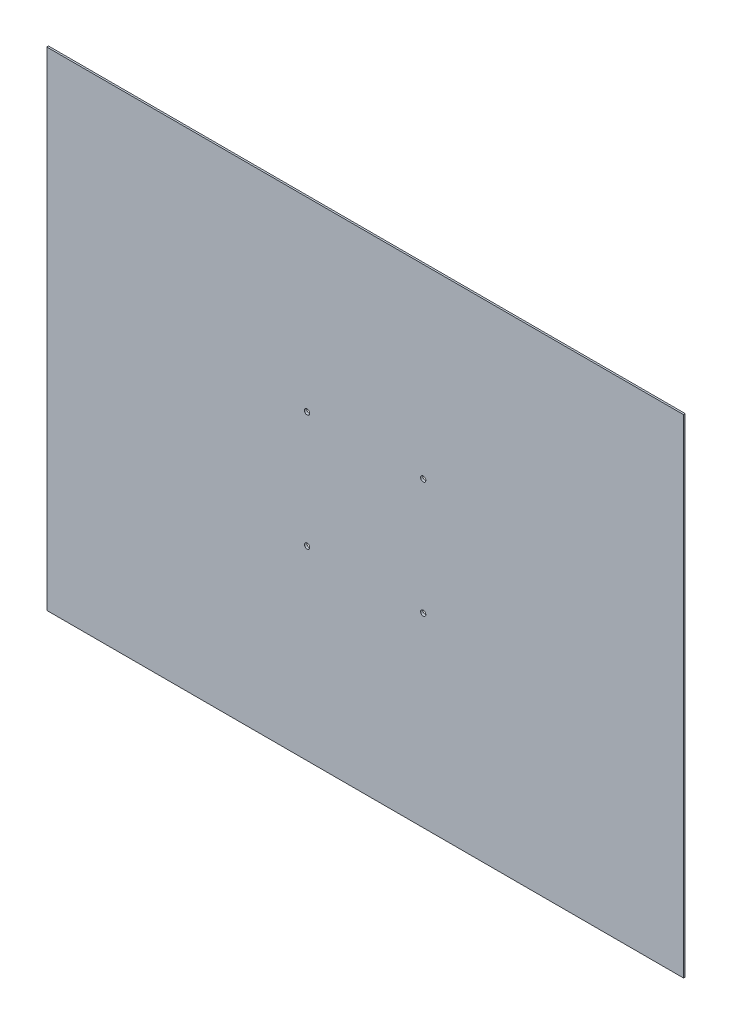
ISO-10303-21;
HEADER;
FILE_DESCRIPTION(('STEP AP214'),'2;1');
FILE_NAME('part.step','',(''),(''),'','','');
FILE_SCHEMA(('AUTOMOTIVE_DESIGN { 1 0 10303 214 1 1 1 1 }'));
ENDSEC;
DATA;
#1=APPLICATION_CONTEXT('core data for automotive mechanical design processes');
#2=APPLICATION_PROTOCOL_DEFINITION('international standard','automotive_design',2000,#1);
#3=PRODUCT_CONTEXT('',#1,'mechanical');
#4=PRODUCT('Part','Part','',(#3));
#5=PRODUCT_RELATED_PRODUCT_CATEGORY('part','',(#4));
#6=PRODUCT_DEFINITION_FORMATION('','',#4);
#7=PRODUCT_DEFINITION_CONTEXT('part definition',#1,'design');
#8=PRODUCT_DEFINITION('design','',#6,#7);
#9=PRODUCT_DEFINITION_SHAPE('','',#8);
#10=(LENGTH_UNIT() NAMED_UNIT(*) SI_UNIT(.MILLI.,.METRE.));
#11=(NAMED_UNIT(*) PLANE_ANGLE_UNIT() SI_UNIT($,.RADIAN.));
#12=(NAMED_UNIT(*) SI_UNIT($,.STERADIAN.) SOLID_ANGLE_UNIT());
#13=UNCERTAINTY_MEASURE_WITH_UNIT(LENGTH_MEASURE(1.E-05),#10,'distance_accuracy_value','');
#14=(GEOMETRIC_REPRESENTATION_CONTEXT(3) GLOBAL_UNCERTAINTY_ASSIGNED_CONTEXT((#13)) GLOBAL_UNIT_ASSIGNED_CONTEXT((#10,
#11,#12)) REPRESENTATION_CONTEXT('',''));
#15=CARTESIAN_POINT('',(0.,0.,0.));
#16=DIRECTION('',(0.,0.,1.));
#17=DIRECTION('',(1.,0.,0.));
#18=AXIS2_PLACEMENT_3D('',#15,#16,#17);
#19=CARTESIAN_POINT('',(0.,0.,110.));
#20=DIRECTION('',(0.,0.,1.));
#21=DIRECTION('',(1.,0.,0.));
#22=AXIS2_PLACEMENT_3D('',#19,#20,#21);
#23=PLANE('',#22);
#24=CARTESIAN_POINT('',(50.,50.,110.));
#25=DIRECTION('',(0.,0.,1.));
#26=DIRECTION('',(1.,0.,0.));
#27=AXIS2_PLACEMENT_3D('',#24,#25,#26);
#28=CIRCLE('',#27,2.25);
#29=CARTESIAN_POINT('',(52.25,50.,110.));
#30=VERTEX_POINT('',#29);
#31=EDGE_CURVE('E159',#30,#30,#28,.T.);
#32=ORIENTED_EDGE('',*,*,#31,.F.);
#33=EDGE_LOOP('',(#32));
#34=FACE_BOUND('',#33,.T.);
#35=CARTESIAN_POINT('',(50.,-50.,110.));
#36=DIRECTION('',(0.,0.,1.));
#37=DIRECTION('',(1.,0.,0.));
#38=AXIS2_PLACEMENT_3D('',#35,#36,#37);
#39=CIRCLE('',#38,2.25);
#40=CARTESIAN_POINT('',(52.25,-50.,110.));
#41=VERTEX_POINT('',#40);
#42=EDGE_CURVE('E156',#41,#41,#39,.T.);
#43=ORIENTED_EDGE('',*,*,#42,.F.);
#44=EDGE_LOOP('',(#43));
#45=FACE_BOUND('',#44,.T.);
#46=CARTESIAN_POINT('',(-50.,50.,110.));
#47=DIRECTION('',(0.,0.,1.));
#48=DIRECTION('',(1.,0.,0.));
#49=AXIS2_PLACEMENT_3D('',#46,#47,#48);
#50=CIRCLE('',#49,2.25);
#51=CARTESIAN_POINT('',(-47.75,50.,110.));
#52=VERTEX_POINT('',#51);
#53=EDGE_CURVE('E153',#52,#52,#50,.T.);
#54=ORIENTED_EDGE('',*,*,#53,.F.);
#55=EDGE_LOOP('',(#54));
#56=FACE_BOUND('',#55,.T.);
#57=CARTESIAN_POINT('',(-50.,-50.,110.));
#58=DIRECTION('',(0.,0.,1.));
#59=DIRECTION('',(1.,0.,0.));
#60=AXIS2_PLACEMENT_3D('',#57,#58,#59);
#61=CIRCLE('',#60,2.25);
#62=CARTESIAN_POINT('',(-47.75,-50.,110.));
#63=VERTEX_POINT('',#62);
#64=EDGE_CURVE('E98',#63,#63,#61,.T.);
#65=ORIENTED_EDGE('',*,*,#64,.F.);
#66=EDGE_LOOP('',(#65));
#67=FACE_BOUND('',#66,.T.);
#68=DIRECTION('',(-1.,0.,0.));
#69=VECTOR('',#68,1.);
#70=CARTESIAN_POINT('',(0.,-210.,110.));
#71=LINE('',#70,#69);
#72=CARTESIAN_POINT('',(274.,-210.,110.));
#73=VERTEX_POINT('',#72);
#74=CARTESIAN_POINT('',(-274.,-210.,110.));
#75=VERTEX_POINT('',#74);
#76=EDGE_CURVE('E145',#73,#75,#71,.T.);
#77=ORIENTED_EDGE('',*,*,#76,.F.);
#78=DIRECTION('',(0.,-1.,0.));
#79=VECTOR('',#78,1.);
#80=CARTESIAN_POINT('',(274.,0.,110.));
#81=LINE('',#80,#79);
#82=CARTESIAN_POINT('',(274.,210.,110.));
#83=VERTEX_POINT('',#82);
#84=EDGE_CURVE('E138',#83,#73,#81,.T.);
#85=ORIENTED_EDGE('',*,*,#84,.F.);
#86=DIRECTION('',(1.,0.,0.));
#87=VECTOR('',#86,1.);
#88=CARTESIAN_POINT('',(0.,210.,110.));
#89=LINE('',#88,#87);
#90=CARTESIAN_POINT('',(-274.,210.,110.));
#91=VERTEX_POINT('',#90);
#92=EDGE_CURVE('E141',#91,#83,#89,.T.);
#93=ORIENTED_EDGE('',*,*,#92,.F.);
#94=DIRECTION('',(0.,1.,0.));
#95=VECTOR('',#94,1.);
#96=CARTESIAN_POINT('',(-274.,0.,110.));
#97=LINE('',#96,#95);
#98=EDGE_CURVE('E143',#75,#91,#97,.T.);
#99=ORIENTED_EDGE('',*,*,#98,.F.);
#100=EDGE_LOOP('',(#77,#85,#93,#99));
#101=FACE_BOUND('',#100,.T.);
#102=ADVANCED_FACE('F16',(#34,#45,#56,#67,#101),#23,.T.);
#103=CARTESIAN_POINT('',(0.,-210.,108.5));
#104=DIRECTION('',(0.,-1.,0.));
#105=DIRECTION('',(0.,0.,-1.));
#106=AXIS2_PLACEMENT_3D('',#103,#104,#105);
#107=PLANE('',#106);
#108=DIRECTION('',(0.,0.,1.));
#109=VECTOR('',#108,1.);
#110=CARTESIAN_POINT('',(274.,-210.,108.5));
#111=LINE('',#110,#109);
#112=CARTESIAN_POINT('',(274.,-210.,108.5));
#113=VERTEX_POINT('',#112);
#114=EDGE_CURVE('E121',#113,#73,#111,.T.);
#115=ORIENTED_EDGE('',*,*,#114,.T.);
#116=ORIENTED_EDGE('',*,*,#76,.T.);
#117=DIRECTION('',(0.,0.,1.));
#118=VECTOR('',#117,1.);
#119=CARTESIAN_POINT('',(-274.,-210.,108.5));
#120=LINE('',#119,#118);
#121=CARTESIAN_POINT('',(-274.,-210.,108.5));
#122=VERTEX_POINT('',#121);
#123=EDGE_CURVE('E135',#122,#75,#120,.T.);
#124=ORIENTED_EDGE('',*,*,#123,.F.);
#125=DIRECTION('',(1.,0.,0.));
#126=VECTOR('',#125,1.);
#127=CARTESIAN_POINT('',(0.,-210.,108.5));
#128=LINE('',#127,#126);
#129=EDGE_CURVE('E114',#122,#113,#128,.T.);
#130=ORIENTED_EDGE('',*,*,#129,.T.);
#131=EDGE_LOOP('',(#115,#116,#124,#130));
#132=FACE_BOUND('',#131,.T.);
#133=ADVANCED_FACE('F179',(#132),#107,.T.);
#134=CARTESIAN_POINT('',(-274.,0.,108.5));
#135=DIRECTION('',(-1.,0.,0.));
#136=DIRECTION('',(0.,0.,1.));
#137=AXIS2_PLACEMENT_3D('',#134,#135,#136);
#138=PLANE('',#137);
#139=ORIENTED_EDGE('',*,*,#123,.T.);
#140=ORIENTED_EDGE('',*,*,#98,.T.);
#141=DIRECTION('',(0.,0.,1.));
#142=VECTOR('',#141,1.);
#143=CARTESIAN_POINT('',(-274.,210.,108.5));
#144=LINE('',#143,#142);
#145=CARTESIAN_POINT('',(-274.,210.,108.5));
#146=VERTEX_POINT('',#145);
#147=EDGE_CURVE('E132',#146,#91,#144,.T.);
#148=ORIENTED_EDGE('',*,*,#147,.F.);
#149=DIRECTION('',(0.,-1.,0.));
#150=VECTOR('',#149,1.);
#151=CARTESIAN_POINT('',(-274.,0.,108.5));
#152=LINE('',#151,#150);
#153=EDGE_CURVE('E117',#146,#122,#152,.T.);
#154=ORIENTED_EDGE('',*,*,#153,.T.);
#155=EDGE_LOOP('',(#139,#140,#148,#154));
#156=FACE_BOUND('',#155,.T.);
#157=ADVANCED_FACE('F196',(#156),#138,.T.);
#158=CARTESIAN_POINT('',(0.,210.,108.5));
#159=DIRECTION('',(0.,1.,0.));
#160=DIRECTION('',(0.,0.,1.));
#161=AXIS2_PLACEMENT_3D('',#158,#159,#160);
#162=PLANE('',#161);
#163=ORIENTED_EDGE('',*,*,#147,.T.);
#164=ORIENTED_EDGE('',*,*,#92,.T.);
#165=DIRECTION('',(0.,0.,1.));
#166=VECTOR('',#165,1.);
#167=CARTESIAN_POINT('',(274.,210.,108.5));
#168=LINE('',#167,#166);
#169=CARTESIAN_POINT('',(274.,210.,108.5));
#170=VERTEX_POINT('',#169);
#171=EDGE_CURVE('E129',#170,#83,#168,.T.);
#172=ORIENTED_EDGE('',*,*,#171,.F.);
#173=DIRECTION('',(-1.,0.,0.));
#174=VECTOR('',#173,1.);
#175=CARTESIAN_POINT('',(0.,210.,108.5));
#176=LINE('',#175,#174);
#177=EDGE_CURVE('E122',#170,#146,#176,.T.);
#178=ORIENTED_EDGE('',*,*,#177,.T.);
#179=EDGE_LOOP('',(#163,#164,#172,#178));
#180=FACE_BOUND('',#179,.T.);
#181=ADVANCED_FACE('F194',(#180),#162,.T.);
#182=CARTESIAN_POINT('',(0.,0.,108.5));
#183=DIRECTION('',(0.,0.,-1.));
#184=DIRECTION('',(-1.,0.,0.));
#185=AXIS2_PLACEMENT_3D('',#182,#183,#184);
#186=PLANE('',#185);
#187=DIRECTION('',(-1.,0.,0.));
#188=VECTOR('',#187,1.);
#189=CARTESIAN_POINT('',(0.,-80.,108.5));
#190=LINE('',#189,#188);
#191=CARTESIAN_POINT('',(80.,-80.,108.5));
#192=VERTEX_POINT('',#191);
#193=CARTESIAN_POINT('',(-80.,-80.,108.5));
#194=VERTEX_POINT('',#193);
#195=EDGE_CURVE('E10',#192,#194,#190,.T.);
#196=ORIENTED_EDGE('',*,*,#195,.F.);
#197=DIRECTION('',(0.,-1.,0.));
#198=VECTOR('',#197,1.);
#199=CARTESIAN_POINT('',(80.,0.,108.5));
#200=LINE('',#199,#198);
#201=CARTESIAN_POINT('',(80.,80.,108.5));
#202=VERTEX_POINT('',#201);
#203=EDGE_CURVE('E85',#202,#192,#200,.T.);
#204=ORIENTED_EDGE('',*,*,#203,.F.);
#205=DIRECTION('',(1.,0.,0.));
#206=VECTOR('',#205,1.);
#207=CARTESIAN_POINT('',(0.,80.,108.5));
#208=LINE('',#207,#206);
#209=CARTESIAN_POINT('',(-80.,80.,108.5));
#210=VERTEX_POINT('',#209);
#211=EDGE_CURVE('E35',#210,#202,#208,.T.);
#212=ORIENTED_EDGE('',*,*,#211,.F.);
#213=DIRECTION('',(0.,1.,0.));
#214=VECTOR('',#213,1.);
#215=CARTESIAN_POINT('',(-80.,0.,108.5));
#216=LINE('',#215,#214);
#217=EDGE_CURVE('E24',#194,#210,#216,.T.);
#218=ORIENTED_EDGE('',*,*,#217,.F.);
#219=EDGE_LOOP('',(#196,#204,#212,#218));
#220=FACE_BOUND('',#219,.T.);
#221=DIRECTION('',(0.,1.,0.));
#222=VECTOR('',#221,1.);
#223=CARTESIAN_POINT('',(274.,0.,108.5));
#224=LINE('',#223,#222);
#225=EDGE_CURVE('E118',#113,#170,#224,.T.);
#226=ORIENTED_EDGE('',*,*,#225,.F.);
#227=ORIENTED_EDGE('',*,*,#129,.F.);
#228=ORIENTED_EDGE('',*,*,#153,.F.);
#229=ORIENTED_EDGE('',*,*,#177,.F.);
#230=EDGE_LOOP('',(#226,#227,#228,#229));
#231=FACE_BOUND('',#230,.T.);
#232=ADVANCED_FACE('F192',(#220,#231),#186,.T.);
#233=CARTESIAN_POINT('',(274.,0.,108.5));
#234=DIRECTION('',(1.,0.,0.));
#235=DIRECTION('',(0.,0.,-1.));
#236=AXIS2_PLACEMENT_3D('',#233,#234,#235);
#237=PLANE('',#236);
#238=ORIENTED_EDGE('',*,*,#225,.T.);
#239=ORIENTED_EDGE('',*,*,#171,.T.);
#240=ORIENTED_EDGE('',*,*,#84,.T.);
#241=ORIENTED_EDGE('',*,*,#114,.F.);
#242=EDGE_LOOP('',(#238,#239,#240,#241));
#243=FACE_BOUND('',#242,.T.);
#244=ADVANCED_FACE('F186',(#243),#237,.T.);
#245=CARTESIAN_POINT('',(0.,-80.,108.));
#246=DIRECTION('',(0.,-1.,0.));
#247=DIRECTION('',(0.,0.,-1.));
#248=AXIS2_PLACEMENT_3D('',#245,#246,#247);
#249=PLANE('',#248);
#250=DIRECTION('',(0.,0.,1.));
#251=VECTOR('',#250,1.);
#252=CARTESIAN_POINT('',(80.,-80.,108.));
#253=LINE('',#252,#251);
#254=CARTESIAN_POINT('',(80.,-80.,108.));
#255=VERTEX_POINT('',#254);
#256=EDGE_CURVE('E79',#255,#192,#253,.T.);
#257=ORIENTED_EDGE('',*,*,#256,.T.);
#258=ORIENTED_EDGE('',*,*,#195,.T.);
#259=DIRECTION('',(0.,0.,1.));
#260=VECTOR('',#259,1.);
#261=CARTESIAN_POINT('',(-80.,-80.,108.));
#262=LINE('',#261,#260);
#263=CARTESIAN_POINT('',(-80.,-80.,108.));
#264=VERTEX_POINT('',#263);
#265=EDGE_CURVE('E93',#264,#194,#262,.T.);
#266=ORIENTED_EDGE('',*,*,#265,.F.);
#267=DIRECTION('',(1.,0.,0.));
#268=VECTOR('',#267,1.);
#269=CARTESIAN_POINT('',(0.,-80.,108.));
#270=LINE('',#269,#268);
#271=EDGE_CURVE('E90',#264,#255,#270,.T.);
#272=ORIENTED_EDGE('',*,*,#271,.T.);
#273=EDGE_LOOP('',(#257,#258,#266,#272));
#274=FACE_BOUND('',#273,.T.);
#275=ADVANCED_FACE('F91',(#274),#249,.T.);
#276=CARTESIAN_POINT('',(-80.,0.,108.));
#277=DIRECTION('',(-1.,0.,0.));
#278=DIRECTION('',(0.,0.,1.));
#279=AXIS2_PLACEMENT_3D('',#276,#277,#278);
#280=PLANE('',#279);
#281=ORIENTED_EDGE('',*,*,#265,.T.);
#282=ORIENTED_EDGE('',*,*,#217,.T.);
#283=DIRECTION('',(0.,0.,1.));
#284=VECTOR('',#283,1.);
#285=CARTESIAN_POINT('',(-80.,80.,108.));
#286=LINE('',#285,#284);
#287=CARTESIAN_POINT('',(-80.,80.,108.));
#288=VERTEX_POINT('',#287);
#289=EDGE_CURVE('E110',#288,#210,#286,.T.);
#290=ORIENTED_EDGE('',*,*,#289,.F.);
#291=DIRECTION('',(0.,-1.,0.));
#292=VECTOR('',#291,1.);
#293=CARTESIAN_POINT('',(-80.,0.,108.));
#294=LINE('',#293,#292);
#295=EDGE_CURVE('E97',#288,#264,#294,.T.);
#296=ORIENTED_EDGE('',*,*,#295,.T.);
#297=EDGE_LOOP('',(#281,#282,#290,#296));
#298=FACE_BOUND('',#297,.T.);
#299=ADVANCED_FACE('F212',(#298),#280,.T.);
#300=CARTESIAN_POINT('',(0.,80.,108.));
#301=DIRECTION('',(0.,1.,0.));
#302=DIRECTION('',(0.,0.,1.));
#303=AXIS2_PLACEMENT_3D('',#300,#301,#302);
#304=PLANE('',#303);
#305=ORIENTED_EDGE('',*,*,#289,.T.);
#306=ORIENTED_EDGE('',*,*,#211,.T.);
#307=DIRECTION('',(0.,0.,1.));
#308=VECTOR('',#307,1.);
#309=CARTESIAN_POINT('',(80.,80.,108.));
#310=LINE('',#309,#308);
#311=CARTESIAN_POINT('',(80.,80.,108.));
#312=VERTEX_POINT('',#311);
#313=EDGE_CURVE('E87',#312,#202,#310,.T.);
#314=ORIENTED_EDGE('',*,*,#313,.F.);
#315=DIRECTION('',(-1.,0.,0.));
#316=VECTOR('',#315,1.);
#317=CARTESIAN_POINT('',(0.,80.,108.));
#318=LINE('',#317,#316);
#319=EDGE_CURVE('E103',#312,#288,#318,.T.);
#320=ORIENTED_EDGE('',*,*,#319,.T.);
#321=EDGE_LOOP('',(#305,#306,#314,#320));
#322=FACE_BOUND('',#321,.T.);
#323=ADVANCED_FACE('F215',(#322),#304,.T.);
#324=CARTESIAN_POINT('',(0.,0.,108.));
#325=DIRECTION('',(0.,0.,-1.));
#326=DIRECTION('',(-1.,0.,0.));
#327=AXIS2_PLACEMENT_3D('',#324,#325,#326);
#328=PLANE('',#327);
#329=CARTESIAN_POINT('',(50.,50.,108.));
#330=DIRECTION('',(0.,0.,-1.));
#331=DIRECTION('',(-1.,0.,0.));
#332=AXIS2_PLACEMENT_3D('',#329,#330,#331);
#333=CIRCLE('',#332,2.25);
#334=CARTESIAN_POINT('',(47.75,50.,108.));
#335=VERTEX_POINT('',#334);
#336=EDGE_CURVE('E19',#335,#335,#333,.T.);
#337=ORIENTED_EDGE('',*,*,#336,.F.);
#338=EDGE_LOOP('',(#337));
#339=FACE_BOUND('',#338,.T.);
#340=CARTESIAN_POINT('',(50.,-50.,108.));
#341=DIRECTION('',(0.,0.,-1.));
#342=DIRECTION('',(-1.,0.,0.));
#343=AXIS2_PLACEMENT_3D('',#340,#341,#342);
#344=CIRCLE('',#343,2.25);
#345=CARTESIAN_POINT('',(47.75,-50.,108.));
#346=VERTEX_POINT('',#345);
#347=EDGE_CURVE('E157',#346,#346,#344,.T.);
#348=ORIENTED_EDGE('',*,*,#347,.F.);
#349=EDGE_LOOP('',(#348));
#350=FACE_BOUND('',#349,.T.);
#351=CARTESIAN_POINT('',(-50.,50.,108.));
#352=DIRECTION('',(0.,0.,-1.));
#353=DIRECTION('',(-1.,0.,0.));
#354=AXIS2_PLACEMENT_3D('',#351,#352,#353);
#355=CIRCLE('',#354,2.25);
#356=CARTESIAN_POINT('',(-52.25,50.,108.));
#357=VERTEX_POINT('',#356);
#358=EDGE_CURVE('E154',#357,#357,#355,.T.);
#359=ORIENTED_EDGE('',*,*,#358,.F.);
#360=EDGE_LOOP('',(#359));
#361=FACE_BOUND('',#360,.T.);
#362=CARTESIAN_POINT('',(-50.,-50.,108.));
#363=DIRECTION('',(0.,0.,-1.));
#364=DIRECTION('',(-1.,0.,0.));
#365=AXIS2_PLACEMENT_3D('',#362,#363,#364);
#366=CIRCLE('',#365,2.25);
#367=CARTESIAN_POINT('',(-52.25,-50.,108.));
#368=VERTEX_POINT('',#367);
#369=EDGE_CURVE('E150',#368,#368,#366,.T.);
#370=ORIENTED_EDGE('',*,*,#369,.F.);
#371=EDGE_LOOP('',(#370));
#372=FACE_BOUND('',#371,.T.);
#373=DIRECTION('',(0.,1.,0.));
#374=VECTOR('',#373,1.);
#375=CARTESIAN_POINT('',(80.,0.,108.));
#376=LINE('',#375,#374);
#377=EDGE_CURVE('E84',#255,#312,#376,.T.);
#378=ORIENTED_EDGE('',*,*,#377,.F.);
#379=ORIENTED_EDGE('',*,*,#271,.F.);
#380=ORIENTED_EDGE('',*,*,#295,.F.);
#381=ORIENTED_EDGE('',*,*,#319,.F.);
#382=EDGE_LOOP('',(#378,#379,#380,#381));
#383=FACE_BOUND('',#382,.T.);
#384=ADVANCED_FACE('F101',(#339,#350,#361,#372,#383),#328,.T.);
#385=CARTESIAN_POINT('',(80.,0.,108.));
#386=DIRECTION('',(1.,0.,0.));
#387=DIRECTION('',(0.,0.,-1.));
#388=AXIS2_PLACEMENT_3D('',#385,#386,#387);
#389=PLANE('',#388);
#390=ORIENTED_EDGE('',*,*,#313,.T.);
#391=ORIENTED_EDGE('',*,*,#203,.T.);
#392=ORIENTED_EDGE('',*,*,#256,.F.);
#393=ORIENTED_EDGE('',*,*,#377,.T.);
#394=EDGE_LOOP('',(#390,#391,#392,#393));
#395=FACE_BOUND('',#394,.T.);
#396=ADVANCED_FACE('F82',(#395),#389,.T.);
#397=CARTESIAN_POINT('',(-50.,-50.,107.7));
#398=DIRECTION('',(0.,0.,1.));
#399=DIRECTION('',(1.,0.,0.));
#400=AXIS2_PLACEMENT_3D('',#397,#398,#399);
#401=CYLINDRICAL_SURFACE('',#400,2.25);
#402=ORIENTED_EDGE('',*,*,#64,.T.);
#403=EDGE_LOOP('',(#402));
#404=FACE_BOUND('',#403,.T.);
#405=ORIENTED_EDGE('',*,*,#369,.T.);
#406=EDGE_LOOP('',(#405));
#407=FACE_BOUND('',#406,.T.);
#408=ADVANCED_FACE('F174',(#404,#407),#401,.F.);
#409=CARTESIAN_POINT('',(-50.,50.,107.7));
#410=DIRECTION('',(0.,0.,1.));
#411=DIRECTION('',(1.,0.,0.));
#412=AXIS2_PLACEMENT_3D('',#409,#410,#411);
#413=CYLINDRICAL_SURFACE('',#412,2.25);
#414=ORIENTED_EDGE('',*,*,#53,.T.);
#415=EDGE_LOOP('',(#414));
#416=FACE_BOUND('',#415,.T.);
#417=ORIENTED_EDGE('',*,*,#358,.T.);
#418=EDGE_LOOP('',(#417));
#419=FACE_BOUND('',#418,.T.);
#420=ADVANCED_FACE('F227',(#416,#419),#413,.F.);
#421=CARTESIAN_POINT('',(50.,-50.,107.7));
#422=DIRECTION('',(0.,0.,1.));
#423=DIRECTION('',(1.,0.,0.));
#424=AXIS2_PLACEMENT_3D('',#421,#422,#423);
#425=CYLINDRICAL_SURFACE('',#424,2.25);
#426=ORIENTED_EDGE('',*,*,#42,.T.);
#427=EDGE_LOOP('',(#426));
#428=FACE_BOUND('',#427,.T.);
#429=ORIENTED_EDGE('',*,*,#347,.T.);
#430=EDGE_LOOP('',(#429));
#431=FACE_BOUND('',#430,.T.);
#432=ADVANCED_FACE('F230',(#428,#431),#425,.F.);
#433=CARTESIAN_POINT('',(50.,50.,107.7));
#434=DIRECTION('',(0.,0.,1.));
#435=DIRECTION('',(1.,0.,0.));
#436=AXIS2_PLACEMENT_3D('',#433,#434,#435);
#437=CYLINDRICAL_SURFACE('',#436,2.25);
#438=ORIENTED_EDGE('',*,*,#31,.T.);
#439=EDGE_LOOP('',(#438));
#440=FACE_BOUND('',#439,.T.);
#441=ORIENTED_EDGE('',*,*,#336,.T.);
#442=EDGE_LOOP('',(#441));
#443=FACE_BOUND('',#442,.T.);
#444=ADVANCED_FACE('F234',(#440,#443),#437,.F.);
#445=CLOSED_SHELL('',(#102,#133,#157,#181,#232,#244,#275,#299,#323,#384,#396,#408,#420,#432,#444));
#446=MANIFOLD_SOLID_BREP('B1',#445);
#447=ADVANCED_BREP_SHAPE_REPRESENTATION('',(#18,#446),#14);
#448=SHAPE_DEFINITION_REPRESENTATION(#9,#447);
ENDSEC;
END-ISO-10303-21;
